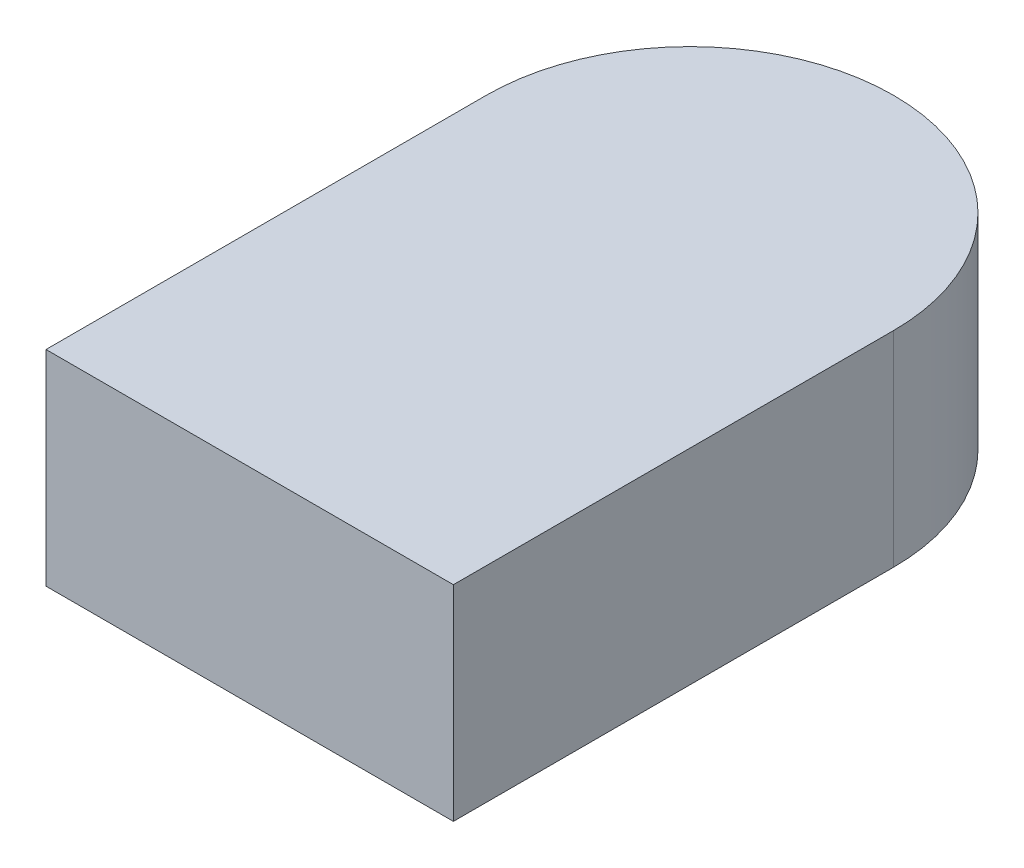
ISO-10303-21;
HEADER;
FILE_DESCRIPTION(('STEP AP214'),'2;1');
FILE_NAME('part.step','',(''),(''),'','','');
FILE_SCHEMA(('AUTOMOTIVE_DESIGN { 1 0 10303 214 1 1 1 1 }'));
ENDSEC;
DATA;
#1=APPLICATION_CONTEXT('core data for automotive mechanical design processes');
#2=APPLICATION_PROTOCOL_DEFINITION('international standard','automotive_design',2000,#1);
#3=PRODUCT_CONTEXT('',#1,'mechanical');
#4=PRODUCT('Part','Part','',(#3));
#5=PRODUCT_RELATED_PRODUCT_CATEGORY('part','',(#4));
#6=PRODUCT_DEFINITION_FORMATION('','',#4);
#7=PRODUCT_DEFINITION_CONTEXT('part definition',#1,'design');
#8=PRODUCT_DEFINITION('design','',#6,#7);
#9=PRODUCT_DEFINITION_SHAPE('','',#8);
#10=(LENGTH_UNIT() NAMED_UNIT(*) SI_UNIT(.MILLI.,.METRE.));
#11=(NAMED_UNIT(*) PLANE_ANGLE_UNIT() SI_UNIT($,.RADIAN.));
#12=(NAMED_UNIT(*) SI_UNIT($,.STERADIAN.) SOLID_ANGLE_UNIT());
#13=UNCERTAINTY_MEASURE_WITH_UNIT(LENGTH_MEASURE(1.E-05),#10,'distance_accuracy_value','');
#14=(GEOMETRIC_REPRESENTATION_CONTEXT(3) GLOBAL_UNCERTAINTY_ASSIGNED_CONTEXT((#13)) GLOBAL_UNIT_ASSIGNED_CONTEXT((#10,
#11,#12)) REPRESENTATION_CONTEXT('',''));
#15=CARTESIAN_POINT('',(0.,0.,0.));
#16=DIRECTION('',(0.,0.,1.));
#17=DIRECTION('',(1.,0.,0.));
#18=AXIS2_PLACEMENT_3D('',#15,#16,#17);
#19=CARTESIAN_POINT('',(0.,15.6,0.));
#20=DIRECTION('',(0.,-1.,0.));
#21=DIRECTION('',(0.,0.,-1.));
#22=AXIS2_PLACEMENT_3D('',#19,#20,#21);
#23=CYLINDRICAL_SURFACE('',#22,15.5);
#24=CARTESIAN_POINT('',(0.,0.,0.));
#25=DIRECTION('',(0.,1.,0.));
#26=DIRECTION('',(0.,0.,-1.));
#27=AXIS2_PLACEMENT_3D('',#24,#25,#26);
#28=CIRCLE('',#27,15.5);
#29=CARTESIAN_POINT('',(15.5,0.,0.));
#30=VERTEX_POINT('',#29);
#31=CARTESIAN_POINT('',(-15.5,0.,0.));
#32=VERTEX_POINT('',#31);
#33=EDGE_CURVE('E100',#30,#32,#28,.T.);
#34=ORIENTED_EDGE('',*,*,#33,.T.);
#35=DIRECTION('',(0.,-1.,0.));
#36=VECTOR('',#35,1.);
#37=CARTESIAN_POINT('',(-15.5,15.6,0.));
#38=LINE('',#37,#36);
#39=CARTESIAN_POINT('',(-15.5,15.6,0.));
#40=VERTEX_POINT('',#39);
#41=EDGE_CURVE('E11',#40,#32,#38,.T.);
#42=ORIENTED_EDGE('',*,*,#41,.F.);
#43=CARTESIAN_POINT('',(0.,15.6,0.));
#44=DIRECTION('',(0.,1.,0.));
#45=DIRECTION('',(0.,0.,-1.));
#46=AXIS2_PLACEMENT_3D('',#43,#44,#45);
#47=CIRCLE('',#46,15.5);
#48=CARTESIAN_POINT('',(15.5,15.6,0.));
#49=VERTEX_POINT('',#48);
#50=EDGE_CURVE('E88',#49,#40,#47,.T.);
#51=ORIENTED_EDGE('',*,*,#50,.F.);
#52=DIRECTION('',(0.,-1.,0.));
#53=VECTOR('',#52,1.);
#54=CARTESIAN_POINT('',(15.5,15.6,0.));
#55=LINE('',#54,#53);
#56=EDGE_CURVE('E96',#49,#30,#55,.T.);
#57=ORIENTED_EDGE('',*,*,#56,.T.);
#58=EDGE_LOOP('',(#34,#42,#51,#57));
#59=FACE_BOUND('',#58,.T.);
#60=ADVANCED_FACE('F37',(#59),#23,.T.);
#61=CARTESIAN_POINT('',(-15.5,15.6,0.));
#62=DIRECTION('',(1.,0.,0.));
#63=DIRECTION('',(0.,0.,-1.));
#64=AXIS2_PLACEMENT_3D('',#61,#62,#63);
#65=PLANE('',#64);
#66=DIRECTION('',(0.,0.,1.));
#67=VECTOR('',#66,1.);
#68=CARTESIAN_POINT('',(-15.5,0.,0.));
#69=LINE('',#68,#67);
#70=CARTESIAN_POINT('',(-15.5,0.,33.5));
#71=VERTEX_POINT('',#70);
#72=EDGE_CURVE('E92',#32,#71,#69,.T.);
#73=ORIENTED_EDGE('',*,*,#72,.T.);
#74=DIRECTION('',(0.,-1.,0.));
#75=VECTOR('',#74,1.);
#76=CARTESIAN_POINT('',(-15.5,15.6,33.5));
#77=LINE('',#76,#75);
#78=CARTESIAN_POINT('',(-15.5,15.6,33.5));
#79=VERTEX_POINT('',#78);
#80=EDGE_CURVE('E45',#79,#71,#77,.T.);
#81=ORIENTED_EDGE('',*,*,#80,.F.);
#82=DIRECTION('',(0.,0.,1.));
#83=VECTOR('',#82,1.);
#84=CARTESIAN_POINT('',(-15.5,15.6,0.));
#85=LINE('',#84,#83);
#86=EDGE_CURVE('E83',#40,#79,#85,.T.);
#87=ORIENTED_EDGE('',*,*,#86,.F.);
#88=ORIENTED_EDGE('',*,*,#41,.T.);
#89=EDGE_LOOP('',(#73,#81,#87,#88));
#90=FACE_BOUND('',#89,.T.);
#91=ADVANCED_FACE('F91',(#90),#65,.F.);
#92=CARTESIAN_POINT('',(-15.5,15.6,33.5));
#93=DIRECTION('',(0.,0.,-1.));
#94=DIRECTION('',(-1.,0.,0.));
#95=AXIS2_PLACEMENT_3D('',#92,#93,#94);
#96=PLANE('',#95);
#97=DIRECTION('',(1.,0.,0.));
#98=VECTOR('',#97,1.);
#99=CARTESIAN_POINT('',(-15.5,0.,33.5));
#100=LINE('',#99,#98);
#101=CARTESIAN_POINT('',(15.5,0.,33.5));
#102=VERTEX_POINT('',#101);
#103=EDGE_CURVE('E70',#71,#102,#100,.T.);
#104=ORIENTED_EDGE('',*,*,#103,.T.);
#105=DIRECTION('',(0.,-1.,0.));
#106=VECTOR('',#105,1.);
#107=CARTESIAN_POINT('',(15.5,15.6,33.5));
#108=LINE('',#107,#106);
#109=CARTESIAN_POINT('',(15.5,15.6,33.5));
#110=VERTEX_POINT('',#109);
#111=EDGE_CURVE('E93',#110,#102,#108,.T.);
#112=ORIENTED_EDGE('',*,*,#111,.F.);
#113=DIRECTION('',(1.,0.,0.));
#114=VECTOR('',#113,1.);
#115=CARTESIAN_POINT('',(-15.5,15.6,33.5));
#116=LINE('',#115,#114);
#117=EDGE_CURVE('E86',#79,#110,#116,.T.);
#118=ORIENTED_EDGE('',*,*,#117,.F.);
#119=ORIENTED_EDGE('',*,*,#80,.T.);
#120=EDGE_LOOP('',(#104,#112,#118,#119));
#121=FACE_BOUND('',#120,.T.);
#122=ADVANCED_FACE('F94',(#121),#96,.F.);
#123=CARTESIAN_POINT('',(15.5,15.6,33.5));
#124=DIRECTION('',(-1.,0.,0.));
#125=DIRECTION('',(0.,0.,1.));
#126=AXIS2_PLACEMENT_3D('',#123,#124,#125);
#127=PLANE('',#126);
#128=DIRECTION('',(0.,0.,-1.));
#129=VECTOR('',#128,1.);
#130=CARTESIAN_POINT('',(15.5,0.,33.5));
#131=LINE('',#130,#129);
#132=EDGE_CURVE('E76',#102,#30,#131,.T.);
#133=ORIENTED_EDGE('',*,*,#132,.T.);
#134=ORIENTED_EDGE('',*,*,#56,.F.);
#135=DIRECTION('',(0.,0.,-1.));
#136=VECTOR('',#135,1.);
#137=CARTESIAN_POINT('',(15.5,15.6,33.5));
#138=LINE('',#137,#136);
#139=EDGE_CURVE('E53',#110,#49,#138,.T.);
#140=ORIENTED_EDGE('',*,*,#139,.F.);
#141=ORIENTED_EDGE('',*,*,#111,.T.);
#142=EDGE_LOOP('',(#133,#134,#140,#141));
#143=FACE_BOUND('',#142,.T.);
#144=ADVANCED_FACE('F107',(#143),#127,.F.);
#145=CARTESIAN_POINT('',(0.,15.6,0.));
#146=DIRECTION('',(0.,-1.,0.));
#147=DIRECTION('',(0.,0.,-1.));
#148=AXIS2_PLACEMENT_3D('',#145,#146,#147);
#149=PLANE('',#148);
#150=ORIENTED_EDGE('',*,*,#50,.T.);
#151=ORIENTED_EDGE('',*,*,#86,.T.);
#152=ORIENTED_EDGE('',*,*,#117,.T.);
#153=ORIENTED_EDGE('',*,*,#139,.T.);
#154=EDGE_LOOP('',(#150,#151,#152,#153));
#155=FACE_BOUND('',#154,.T.);
#156=ADVANCED_FACE('F84',(#155),#149,.F.);
#157=CARTESIAN_POINT('',(0.,0.,0.));
#158=DIRECTION('',(0.,-1.,0.));
#159=DIRECTION('',(0.,0.,-1.));
#160=AXIS2_PLACEMENT_3D('',#157,#158,#159);
#161=PLANE('',#160);
#162=ORIENTED_EDGE('',*,*,#33,.F.);
#163=ORIENTED_EDGE('',*,*,#132,.F.);
#164=ORIENTED_EDGE('',*,*,#103,.F.);
#165=ORIENTED_EDGE('',*,*,#72,.F.);
#166=EDGE_LOOP('',(#162,#163,#164,#165));
#167=FACE_BOUND('',#166,.T.);
#168=ADVANCED_FACE('F110',(#167),#161,.T.);
#169=CLOSED_SHELL('',(#60,#91,#122,#144,#156,#168));
#170=MANIFOLD_SOLID_BREP('B2',#169);
#171=ADVANCED_BREP_SHAPE_REPRESENTATION('',(#18,#170),#14);
#172=SHAPE_DEFINITION_REPRESENTATION(#9,#171);
ENDSEC;
END-ISO-10303-21;
